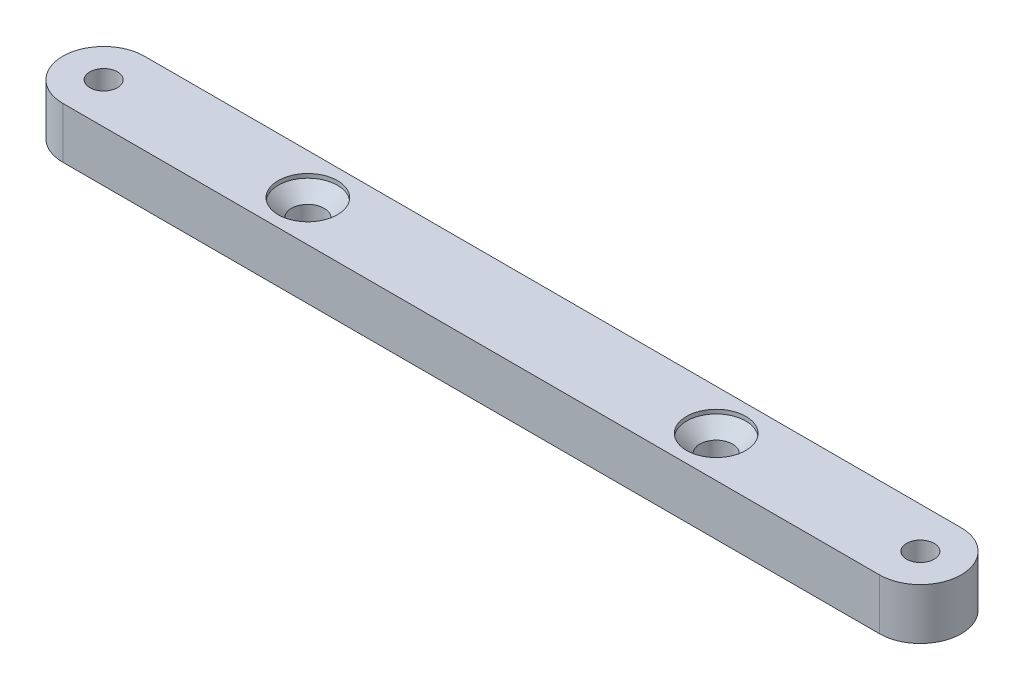
ISO-10303-21;
HEADER;
FILE_DESCRIPTION(('STEP AP214'),'2;1');
FILE_NAME('part.step','',(''),(''),'','','');
FILE_SCHEMA(('AUTOMOTIVE_DESIGN { 1 0 10303 214 1 1 1 1 }'));
ENDSEC;
DATA;
#1=APPLICATION_CONTEXT('core data for automotive mechanical design processes');
#2=APPLICATION_PROTOCOL_DEFINITION('international standard','automotive_design',2000,#1);
#3=PRODUCT_CONTEXT('',#1,'mechanical');
#4=PRODUCT('Part','Part','',(#3));
#5=PRODUCT_RELATED_PRODUCT_CATEGORY('part','',(#4));
#6=PRODUCT_DEFINITION_FORMATION('','',#4);
#7=PRODUCT_DEFINITION_CONTEXT('part definition',#1,'design');
#8=PRODUCT_DEFINITION('design','',#6,#7);
#9=PRODUCT_DEFINITION_SHAPE('','',#8);
#10=(LENGTH_UNIT() NAMED_UNIT(*) SI_UNIT(.MILLI.,.METRE.));
#11=(NAMED_UNIT(*) PLANE_ANGLE_UNIT() SI_UNIT($,.RADIAN.));
#12=(NAMED_UNIT(*) SI_UNIT($,.STERADIAN.) SOLID_ANGLE_UNIT());
#13=UNCERTAINTY_MEASURE_WITH_UNIT(LENGTH_MEASURE(1.E-05),#10,'distance_accuracy_value','');
#14=(GEOMETRIC_REPRESENTATION_CONTEXT(3) GLOBAL_UNCERTAINTY_ASSIGNED_CONTEXT((#13)) GLOBAL_UNIT_ASSIGNED_CONTEXT((#10,
#11,#12)) REPRESENTATION_CONTEXT('',''));
#15=CARTESIAN_POINT('',(0.,0.,0.));
#16=DIRECTION('',(0.,0.,1.));
#17=DIRECTION('',(1.,0.,0.));
#18=AXIS2_PLACEMENT_3D('',#15,#16,#17);
#19=CARTESIAN_POINT('',(40.,5.,0.));
#20=DIRECTION('',(0.,1.,0.));
#21=DIRECTION('',(0.,0.,1.));
#22=AXIS2_PLACEMENT_3D('',#19,#20,#21);
#23=PLANE('',#22);
#24=CARTESIAN_POINT('',(20.,5.,0.));
#25=DIRECTION('',(0.,1.,0.));
#26=DIRECTION('',(0.,0.,1.));
#27=AXIS2_PLACEMENT_3D('',#24,#25,#26);
#28=CIRCLE('',#27,2.9);
#29=CARTESIAN_POINT('',(20.,5.,2.9));
#30=VERTEX_POINT('',#29);
#31=EDGE_CURVE('E173',#30,#30,#28,.T.);
#32=ORIENTED_EDGE('',*,*,#31,.F.);
#33=EDGE_LOOP('',(#32));
#34=FACE_BOUND('',#33,.T.);
#35=CARTESIAN_POINT('',(-20.,5.,0.));
#36=DIRECTION('',(0.,1.,0.));
#37=DIRECTION('',(0.,0.,1.));
#38=AXIS2_PLACEMENT_3D('',#35,#36,#37);
#39=CIRCLE('',#38,2.9);
#40=CARTESIAN_POINT('',(-20.,5.,2.9));
#41=VERTEX_POINT('',#40);
#42=EDGE_CURVE('E157',#41,#41,#39,.T.);
#43=ORIENTED_EDGE('',*,*,#42,.F.);
#44=EDGE_LOOP('',(#43));
#45=FACE_BOUND('',#44,.T.);
#46=CARTESIAN_POINT('',(-40.,5.,0.));
#47=DIRECTION('',(0.,1.,0.));
#48=DIRECTION('',(0.,0.,1.));
#49=AXIS2_PLACEMENT_3D('',#46,#47,#48);
#50=CIRCLE('',#49,1.35);
#51=CARTESIAN_POINT('',(-40.,5.,1.35000000000002));
#52=VERTEX_POINT('',#51);
#53=EDGE_CURVE('E112',#52,#52,#50,.T.);
#54=ORIENTED_EDGE('',*,*,#53,.F.);
#55=EDGE_LOOP('',(#54));
#56=FACE_BOUND('',#55,.T.);
#57=CARTESIAN_POINT('',(40.,5.,0.));
#58=DIRECTION('',(0.,1.,0.));
#59=DIRECTION('',(0.,0.,1.));
#60=AXIS2_PLACEMENT_3D('',#57,#58,#59);
#61=CIRCLE('',#60,4.);
#62=CARTESIAN_POINT('',(40.,5.,4.));
#63=VERTEX_POINT('',#62);
#64=CARTESIAN_POINT('',(40.,5.,-4.));
#65=VERTEX_POINT('',#64);
#66=EDGE_CURVE('E92',#63,#65,#61,.T.);
#67=ORIENTED_EDGE('',*,*,#66,.T.);
#68=DIRECTION('',(-1.,0.,0.));
#69=VECTOR('',#68,1.);
#70=CARTESIAN_POINT('',(40.,5.,-4.));
#71=LINE('',#70,#69);
#72=CARTESIAN_POINT('',(-40.,5.,-3.99999999999998));
#73=VERTEX_POINT('',#72);
#74=EDGE_CURVE('E87',#65,#73,#71,.T.);
#75=ORIENTED_EDGE('',*,*,#74,.T.);
#76=CARTESIAN_POINT('',(-40.,5.,0.));
#77=DIRECTION('',(0.,1.,0.));
#78=DIRECTION('',(0.,0.,1.));
#79=AXIS2_PLACEMENT_3D('',#76,#77,#78);
#80=CIRCLE('',#79,4.);
#81=CARTESIAN_POINT('',(-40.,5.,4.00000000000001));
#82=VERTEX_POINT('',#81);
#83=EDGE_CURVE('E90',#73,#82,#80,.T.);
#84=ORIENTED_EDGE('',*,*,#83,.T.);
#85=DIRECTION('',(1.,0.,0.));
#86=VECTOR('',#85,1.);
#87=CARTESIAN_POINT('',(40.,5.,4.));
#88=LINE('',#87,#86);
#89=EDGE_CURVE('E57',#82,#63,#88,.T.);
#90=ORIENTED_EDGE('',*,*,#89,.T.);
#91=EDGE_LOOP('',(#67,#75,#84,#90));
#92=FACE_BOUND('',#91,.T.);
#93=CARTESIAN_POINT('',(40.,5.,0.));
#94=DIRECTION('',(0.,1.,0.));
#95=DIRECTION('',(0.,0.,-1.));
#96=AXIS2_PLACEMENT_3D('',#93,#94,#95);
#97=CIRCLE('',#96,1.35);
#98=CARTESIAN_POINT('',(40.,5.,-1.34999999999998));
#99=VERTEX_POINT('',#98);
#100=EDGE_CURVE('E134',#99,#99,#97,.T.);
#101=ORIENTED_EDGE('',*,*,#100,.F.);
#102=EDGE_LOOP('',(#101));
#103=FACE_BOUND('',#102,.T.);
#104=ADVANCED_FACE('F39',(#34,#45,#56,#92,#103),#23,.T.);
#105=CARTESIAN_POINT('',(40.,0.,0.));
#106=DIRECTION('',(0.,1.,0.));
#107=DIRECTION('',(0.,0.,1.));
#108=AXIS2_PLACEMENT_3D('',#105,#106,#107);
#109=PLANE('',#108);
#110=CARTESIAN_POINT('',(20.,0.,0.));
#111=DIRECTION('',(0.,1.,0.));
#112=DIRECTION('',(0.,0.,1.));
#113=AXIS2_PLACEMENT_3D('',#110,#111,#112);
#114=CIRCLE('',#113,1.6);
#115=CARTESIAN_POINT('',(20.,0.,1.6));
#116=VERTEX_POINT('',#115);
#117=EDGE_CURVE('E161',#116,#116,#114,.T.);
#118=ORIENTED_EDGE('',*,*,#117,.T.);
#119=EDGE_LOOP('',(#118));
#120=FACE_BOUND('',#119,.T.);
#121=CARTESIAN_POINT('',(-20.,0.,0.));
#122=DIRECTION('',(0.,1.,0.));
#123=DIRECTION('',(0.,0.,1.));
#124=AXIS2_PLACEMENT_3D('',#121,#122,#123);
#125=CIRCLE('',#124,1.6);
#126=CARTESIAN_POINT('',(-20.,0.,1.6));
#127=VERTEX_POINT('',#126);
#128=EDGE_CURVE('E142',#127,#127,#125,.T.);
#129=ORIENTED_EDGE('',*,*,#128,.T.);
#130=EDGE_LOOP('',(#129));
#131=FACE_BOUND('',#130,.T.);
#132=CARTESIAN_POINT('',(40.,0.,0.));
#133=DIRECTION('',(0.,1.,0.));
#134=DIRECTION('',(0.,0.,1.));
#135=AXIS2_PLACEMENT_3D('',#132,#133,#134);
#136=CIRCLE('',#135,4.);
#137=CARTESIAN_POINT('',(40.,0.,4.));
#138=VERTEX_POINT('',#137);
#139=CARTESIAN_POINT('',(40.,0.,-4.));
#140=VERTEX_POINT('',#139);
#141=EDGE_CURVE('E108',#138,#140,#136,.T.);
#142=ORIENTED_EDGE('',*,*,#141,.F.);
#143=DIRECTION('',(1.,0.,0.));
#144=VECTOR('',#143,1.);
#145=CARTESIAN_POINT('',(40.,0.,4.));
#146=LINE('',#145,#144);
#147=CARTESIAN_POINT('',(-40.,0.,4.00000000000001));
#148=VERTEX_POINT('',#147);
#149=EDGE_CURVE('E80',#148,#138,#146,.T.);
#150=ORIENTED_EDGE('',*,*,#149,.F.);
#151=CARTESIAN_POINT('',(-40.,0.,0.));
#152=DIRECTION('',(0.,1.,0.));
#153=DIRECTION('',(0.,0.,1.));
#154=AXIS2_PLACEMENT_3D('',#151,#152,#153);
#155=CIRCLE('',#154,4.);
#156=CARTESIAN_POINT('',(-40.,0.,-3.99999999999998));
#157=VERTEX_POINT('',#156);
#158=EDGE_CURVE('E74',#157,#148,#155,.T.);
#159=ORIENTED_EDGE('',*,*,#158,.F.);
#160=DIRECTION('',(-1.,0.,0.));
#161=VECTOR('',#160,1.);
#162=CARTESIAN_POINT('',(40.,0.,-4.));
#163=LINE('',#162,#161);
#164=EDGE_CURVE('E97',#140,#157,#163,.T.);
#165=ORIENTED_EDGE('',*,*,#164,.F.);
#166=EDGE_LOOP('',(#142,#150,#159,#165));
#167=FACE_BOUND('',#166,.T.);
#168=CARTESIAN_POINT('',(-40.,0.,0.));
#169=DIRECTION('',(0.,1.,0.));
#170=DIRECTION('',(0.,0.,1.));
#171=AXIS2_PLACEMENT_3D('',#168,#169,#170);
#172=CIRCLE('',#171,1.35);
#173=CARTESIAN_POINT('',(-40.,0.,1.35000000000002));
#174=VERTEX_POINT('',#173);
#175=EDGE_CURVE('E130',#174,#174,#172,.T.);
#176=ORIENTED_EDGE('',*,*,#175,.T.);
#177=EDGE_LOOP('',(#176));
#178=FACE_BOUND('',#177,.T.);
#179=CARTESIAN_POINT('',(40.,0.,0.));
#180=DIRECTION('',(0.,1.,0.));
#181=DIRECTION('',(0.,0.,-1.));
#182=AXIS2_PLACEMENT_3D('',#179,#180,#181);
#183=CIRCLE('',#182,1.35);
#184=CARTESIAN_POINT('',(40.,0.,-1.34999999999998));
#185=VERTEX_POINT('',#184);
#186=EDGE_CURVE('E138',#185,#185,#183,.T.);
#187=ORIENTED_EDGE('',*,*,#186,.T.);
#188=EDGE_LOOP('',(#187));
#189=FACE_BOUND('',#188,.T.);
#190=ADVANCED_FACE('F125',(#120,#131,#167,#178,#189),#109,.F.);
#191=CARTESIAN_POINT('',(40.,5.,0.));
#192=DIRECTION('',(0.,-1.,0.));
#193=DIRECTION('',(0.,0.,-1.));
#194=AXIS2_PLACEMENT_3D('',#191,#192,#193);
#195=CYLINDRICAL_SURFACE('',#194,4.);
#196=ORIENTED_EDGE('',*,*,#141,.T.);
#197=DIRECTION('',(0.,-1.,0.));
#198=VECTOR('',#197,1.);
#199=CARTESIAN_POINT('',(40.,5.,-4.));
#200=LINE('',#199,#198);
#201=EDGE_CURVE('E11',#65,#140,#200,.T.);
#202=ORIENTED_EDGE('',*,*,#201,.F.);
#203=ORIENTED_EDGE('',*,*,#66,.F.);
#204=DIRECTION('',(0.,-1.,0.));
#205=VECTOR('',#204,1.);
#206=CARTESIAN_POINT('',(40.,5.,4.));
#207=LINE('',#206,#205);
#208=EDGE_CURVE('E104',#63,#138,#207,.T.);
#209=ORIENTED_EDGE('',*,*,#208,.T.);
#210=EDGE_LOOP('',(#196,#202,#203,#209));
#211=FACE_BOUND('',#210,.T.);
#212=ADVANCED_FACE('F41',(#211),#195,.T.);
#213=CARTESIAN_POINT('',(40.,5.,-4.));
#214=DIRECTION('',(0.,0.,1.));
#215=DIRECTION('',(1.,0.,0.));
#216=AXIS2_PLACEMENT_3D('',#213,#214,#215);
#217=PLANE('',#216);
#218=ORIENTED_EDGE('',*,*,#164,.T.);
#219=DIRECTION('',(0.,-1.,0.));
#220=VECTOR('',#219,1.);
#221=CARTESIAN_POINT('',(-40.,5.,-3.99999999999998));
#222=LINE('',#221,#220);
#223=EDGE_CURVE('E49',#73,#157,#222,.T.);
#224=ORIENTED_EDGE('',*,*,#223,.F.);
#225=ORIENTED_EDGE('',*,*,#74,.F.);
#226=ORIENTED_EDGE('',*,*,#201,.T.);
#227=EDGE_LOOP('',(#218,#224,#225,#226));
#228=FACE_BOUND('',#227,.T.);
#229=ADVANCED_FACE('F96',(#228),#217,.F.);
#230=CARTESIAN_POINT('',(-40.,5.,0.));
#231=DIRECTION('',(0.,-1.,0.));
#232=DIRECTION('',(0.,0.,-1.));
#233=AXIS2_PLACEMENT_3D('',#230,#231,#232);
#234=CYLINDRICAL_SURFACE('',#233,4.);
#235=ORIENTED_EDGE('',*,*,#158,.T.);
#236=DIRECTION('',(0.,-1.,0.));
#237=VECTOR('',#236,1.);
#238=CARTESIAN_POINT('',(-40.,5.,4.00000000000001));
#239=LINE('',#238,#237);
#240=EDGE_CURVE('E99',#82,#148,#239,.T.);
#241=ORIENTED_EDGE('',*,*,#240,.F.);
#242=ORIENTED_EDGE('',*,*,#83,.F.);
#243=ORIENTED_EDGE('',*,*,#223,.T.);
#244=EDGE_LOOP('',(#235,#241,#242,#243));
#245=FACE_BOUND('',#244,.T.);
#246=ADVANCED_FACE('F100',(#245),#234,.T.);
#247=CARTESIAN_POINT('',(40.,5.,4.));
#248=DIRECTION('',(0.,0.,-1.));
#249=DIRECTION('',(-1.,0.,0.));
#250=AXIS2_PLACEMENT_3D('',#247,#248,#249);
#251=PLANE('',#250);
#252=ORIENTED_EDGE('',*,*,#149,.T.);
#253=ORIENTED_EDGE('',*,*,#208,.F.);
#254=ORIENTED_EDGE('',*,*,#89,.F.);
#255=ORIENTED_EDGE('',*,*,#240,.T.);
#256=EDGE_LOOP('',(#252,#253,#254,#255));
#257=FACE_BOUND('',#256,.T.);
#258=ADVANCED_FACE('F122',(#257),#251,.F.);
#259=CARTESIAN_POINT('',(-40.,5.,0.));
#260=DIRECTION('',(0.,-1.,0.));
#261=DIRECTION('',(0.,0.,-1.));
#262=AXIS2_PLACEMENT_3D('',#259,#260,#261);
#263=CYLINDRICAL_SURFACE('',#262,1.35);
#264=ORIENTED_EDGE('',*,*,#53,.T.);
#265=EDGE_LOOP('',(#264));
#266=FACE_BOUND('',#265,.T.);
#267=ORIENTED_EDGE('',*,*,#175,.F.);
#268=EDGE_LOOP('',(#267));
#269=FACE_BOUND('',#268,.T.);
#270=ADVANCED_FACE('F187',(#266,#269),#263,.F.);
#271=CARTESIAN_POINT('',(40.,5.,0.));
#272=DIRECTION('',(0.,-1.,0.));
#273=DIRECTION('',(0.,0.,-1.));
#274=AXIS2_PLACEMENT_3D('',#271,#272,#273);
#275=CYLINDRICAL_SURFACE('',#274,1.35);
#276=ORIENTED_EDGE('',*,*,#100,.T.);
#277=EDGE_LOOP('',(#276));
#278=FACE_BOUND('',#277,.T.);
#279=ORIENTED_EDGE('',*,*,#186,.F.);
#280=EDGE_LOOP('',(#279));
#281=FACE_BOUND('',#280,.T.);
#282=ADVANCED_FACE('F190',(#278,#281),#275,.F.);
#283=CARTESIAN_POINT('',(-20.,5.,0.));
#284=DIRECTION('',(0.,1.,0.));
#285=DIRECTION('',(0.,0.,1.));
#286=AXIS2_PLACEMENT_3D('',#283,#284,#285);
#287=CYLINDRICAL_SURFACE('',#286,1.6);
#288=ORIENTED_EDGE('',*,*,#128,.F.);
#289=EDGE_LOOP('',(#288));
#290=FACE_BOUND('',#289,.T.);
#291=CARTESIAN_POINT('',(-20.,3.3,0.));
#292=DIRECTION('',(0.,1.,0.));
#293=DIRECTION('',(0.,0.,1.));
#294=AXIS2_PLACEMENT_3D('',#291,#292,#293);
#295=CIRCLE('',#294,1.6);
#296=CARTESIAN_POINT('',(-20.,3.3,1.6));
#297=VERTEX_POINT('',#296);
#298=EDGE_CURVE('E149',#297,#297,#295,.T.);
#299=ORIENTED_EDGE('',*,*,#298,.T.);
#300=EDGE_LOOP('',(#299));
#301=FACE_BOUND('',#300,.T.);
#302=ADVANCED_FACE('F200',(#290,#301),#287,.F.);
#303=CARTESIAN_POINT('',(-20.,4.6,0.));
#304=DIRECTION('',(0.,1.,0.));
#305=DIRECTION('',(0.,0.,1.));
#306=AXIS2_PLACEMENT_3D('',#303,#304,#305);
#307=CONICAL_SURFACE('',#306,2.9,0.785398163397448);
#308=ORIENTED_EDGE('',*,*,#298,.F.);
#309=EDGE_LOOP('',(#308));
#310=FACE_BOUND('',#309,.T.);
#311=CARTESIAN_POINT('',(-20.,4.6,0.));
#312=DIRECTION('',(0.,1.,0.));
#313=DIRECTION('',(0.,0.,1.));
#314=AXIS2_PLACEMENT_3D('',#311,#312,#313);
#315=CIRCLE('',#314,2.9);
#316=CARTESIAN_POINT('',(-20.,4.6,2.9));
#317=VERTEX_POINT('',#316);
#318=EDGE_CURVE('E153',#317,#317,#315,.T.);
#319=ORIENTED_EDGE('',*,*,#318,.T.);
#320=EDGE_LOOP('',(#319));
#321=FACE_BOUND('',#320,.T.);
#322=ADVANCED_FACE('F206',(#310,#321),#307,.F.);
#323=CARTESIAN_POINT('',(-20.,5.,0.));
#324=DIRECTION('',(0.,1.,0.));
#325=DIRECTION('',(0.,0.,1.));
#326=AXIS2_PLACEMENT_3D('',#323,#324,#325);
#327=CYLINDRICAL_SURFACE('',#326,2.9);
#328=ORIENTED_EDGE('',*,*,#318,.F.);
#329=EDGE_LOOP('',(#328));
#330=FACE_BOUND('',#329,.T.);
#331=ORIENTED_EDGE('',*,*,#42,.T.);
#332=EDGE_LOOP('',(#331));
#333=FACE_BOUND('',#332,.T.);
#334=ADVANCED_FACE('F234',(#330,#333),#327,.F.);
#335=CARTESIAN_POINT('',(20.,5.,0.));
#336=DIRECTION('',(0.,1.,0.));
#337=DIRECTION('',(0.,0.,1.));
#338=AXIS2_PLACEMENT_3D('',#335,#336,#337);
#339=CYLINDRICAL_SURFACE('',#338,1.6);
#340=ORIENTED_EDGE('',*,*,#117,.F.);
#341=EDGE_LOOP('',(#340));
#342=FACE_BOUND('',#341,.T.);
#343=CARTESIAN_POINT('',(20.,3.3,0.));
#344=DIRECTION('',(0.,1.,0.));
#345=DIRECTION('',(0.,0.,1.));
#346=AXIS2_PLACEMENT_3D('',#343,#344,#345);
#347=CIRCLE('',#346,1.6);
#348=CARTESIAN_POINT('',(20.,3.3,1.6));
#349=VERTEX_POINT('',#348);
#350=EDGE_CURVE('E165',#349,#349,#347,.T.);
#351=ORIENTED_EDGE('',*,*,#350,.T.);
#352=EDGE_LOOP('',(#351));
#353=FACE_BOUND('',#352,.T.);
#354=ADVANCED_FACE('F239',(#342,#353),#339,.F.);
#355=CARTESIAN_POINT('',(20.,4.6,0.));
#356=DIRECTION('',(0.,1.,0.));
#357=DIRECTION('',(0.,0.,1.));
#358=AXIS2_PLACEMENT_3D('',#355,#356,#357);
#359=CONICAL_SURFACE('',#358,2.9,0.785398163397448);
#360=ORIENTED_EDGE('',*,*,#350,.F.);
#361=EDGE_LOOP('',(#360));
#362=FACE_BOUND('',#361,.T.);
#363=CARTESIAN_POINT('',(20.,4.6,0.));
#364=DIRECTION('',(0.,1.,0.));
#365=DIRECTION('',(0.,0.,1.));
#366=AXIS2_PLACEMENT_3D('',#363,#364,#365);
#367=CIRCLE('',#366,2.9);
#368=CARTESIAN_POINT('',(20.,4.6,2.9));
#369=VERTEX_POINT('',#368);
#370=EDGE_CURVE('E169',#369,#369,#367,.T.);
#371=ORIENTED_EDGE('',*,*,#370,.T.);
#372=EDGE_LOOP('',(#371));
#373=FACE_BOUND('',#372,.T.);
#374=ADVANCED_FACE('F294',(#362,#373),#359,.F.);
#375=CARTESIAN_POINT('',(20.,5.,0.));
#376=DIRECTION('',(0.,1.,0.));
#377=DIRECTION('',(0.,0.,1.));
#378=AXIS2_PLACEMENT_3D('',#375,#376,#377);
#379=CYLINDRICAL_SURFACE('',#378,2.9);
#380=ORIENTED_EDGE('',*,*,#370,.F.);
#381=EDGE_LOOP('',(#380));
#382=FACE_BOUND('',#381,.T.);
#383=ORIENTED_EDGE('',*,*,#31,.T.);
#384=EDGE_LOOP('',(#383));
#385=FACE_BOUND('',#384,.T.);
#386=ADVANCED_FACE('F178',(#382,#385),#379,.F.);
#387=CLOSED_SHELL('',(#104,#190,#212,#229,#246,#258,#270,#282,#302,#322,#334,#354,#374,#386));
#388=MANIFOLD_SOLID_BREP('B2',#387);
#389=ADVANCED_BREP_SHAPE_REPRESENTATION('',(#18,#388),#14);
#390=SHAPE_DEFINITION_REPRESENTATION(#9,#389);
ENDSEC;
END-ISO-10303-21;
